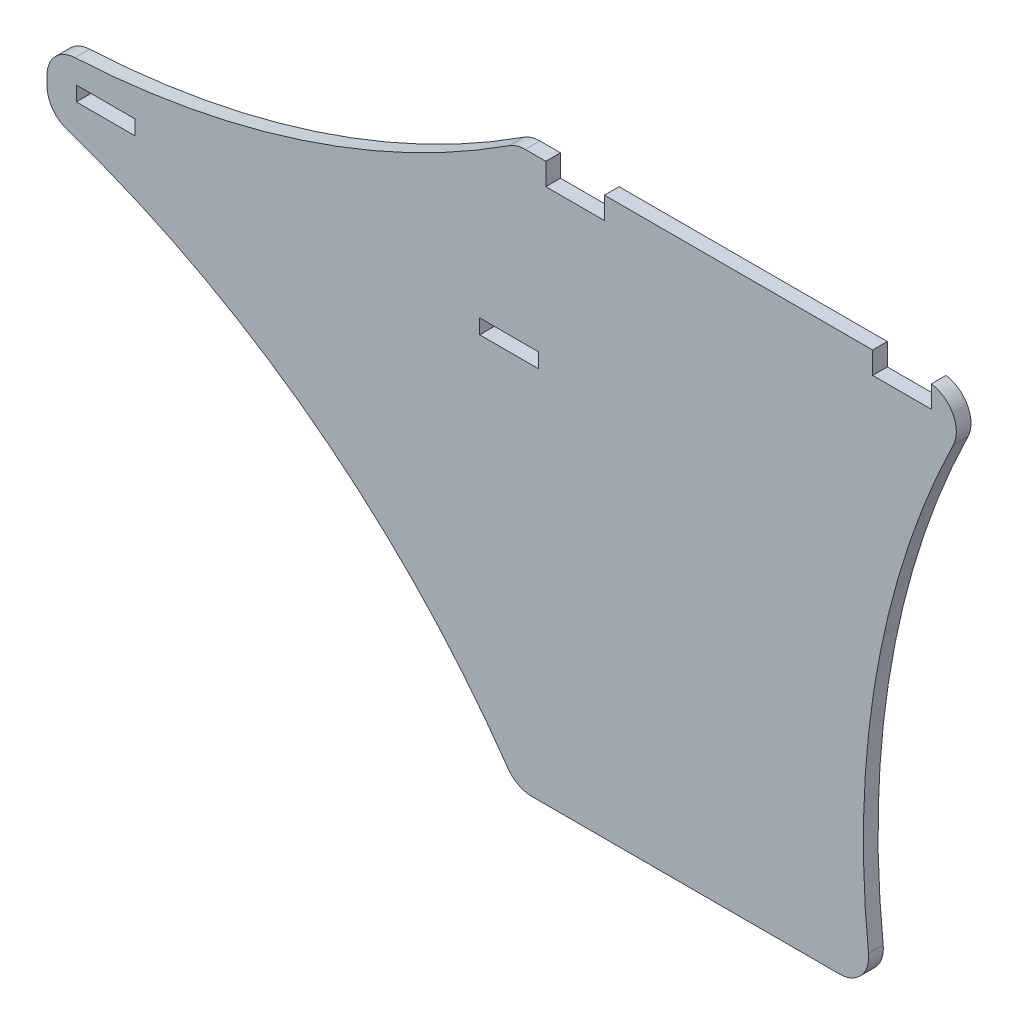
ISO-10303-21;
HEADER;
FILE_DESCRIPTION(('STEP AP214'),'2;1');
FILE_NAME('part.step','',(''),(''),'','','');
FILE_SCHEMA(('AUTOMOTIVE_DESIGN { 1 0 10303 214 1 1 1 1 }'));
ENDSEC;
DATA;
#1=APPLICATION_CONTEXT('core data for automotive mechanical design processes');
#2=APPLICATION_PROTOCOL_DEFINITION('international standard','automotive_design',2000,#1);
#3=PRODUCT_CONTEXT('',#1,'mechanical');
#4=PRODUCT('Part','Part','',(#3));
#5=PRODUCT_RELATED_PRODUCT_CATEGORY('part','',(#4));
#6=PRODUCT_DEFINITION_FORMATION('','',#4);
#7=PRODUCT_DEFINITION_CONTEXT('part definition',#1,'design');
#8=PRODUCT_DEFINITION('design','',#6,#7);
#9=PRODUCT_DEFINITION_SHAPE('','',#8);
#10=(LENGTH_UNIT() NAMED_UNIT(*) SI_UNIT(.MILLI.,.METRE.));
#11=(NAMED_UNIT(*) PLANE_ANGLE_UNIT() SI_UNIT($,.RADIAN.));
#12=(NAMED_UNIT(*) SI_UNIT($,.STERADIAN.) SOLID_ANGLE_UNIT());
#13=UNCERTAINTY_MEASURE_WITH_UNIT(LENGTH_MEASURE(1.E-05),#10,'distance_accuracy_value','');
#14=(GEOMETRIC_REPRESENTATION_CONTEXT(3) GLOBAL_UNCERTAINTY_ASSIGNED_CONTEXT((#13)) GLOBAL_UNIT_ASSIGNED_CONTEXT((#10,
#11,#12)) REPRESENTATION_CONTEXT('',''));
#15=CARTESIAN_POINT('',(0.,0.,0.));
#16=DIRECTION('',(0.,0.,1.));
#17=DIRECTION('',(1.,0.,0.));
#18=AXIS2_PLACEMENT_3D('',#15,#16,#17);
#19=CARTESIAN_POINT('',(-232.821173919376,-373.145632126541,6.35));
#20=DIRECTION('',(0.,0.,-1.));
#21=DIRECTION('',(-1.,0.,0.));
#22=AXIS2_PLACEMENT_3D('',#19,#20,#21);
#23=CYLINDRICAL_SURFACE('',#22,381.);
#24=CARTESIAN_POINT('',(-232.821173919376,-373.145632126541,0.));
#25=DIRECTION('',(0.,0.,-1.));
#26=DIRECTION('',(-1.,0.,0.));
#27=AXIS2_PLACEMENT_3D('',#24,#25,#26);
#28=CIRCLE('',#27,381.);
#29=CARTESIAN_POINT('',(-110.441812061915,-12.335028358635,0.));
#30=VERTEX_POINT('',#29);
#31=CARTESIAN_POINT('',(80.4677697258344,-156.325342970595,0.));
#32=VERTEX_POINT('',#31);
#33=EDGE_CURVE('E286',#30,#32,#28,.T.);
#34=ORIENTED_EDGE('',*,*,#33,.T.);
#35=DIRECTION('',(0.,0.,-1.));
#36=VECTOR('',#35,1.);
#37=CARTESIAN_POINT('',(80.4677697258345,-156.325342970595,6.35));
#38=LINE('',#37,#36);
#39=CARTESIAN_POINT('',(80.4677697258344,-156.325342970595,6.35));
#40=VERTEX_POINT('',#39);
#41=EDGE_CURVE('E391',#32,#40,#38,.F.);
#42=ORIENTED_EDGE('',*,*,#41,.T.);
#43=CARTESIAN_POINT('',(-232.821173919376,-373.145632126541,6.35));
#44=DIRECTION('',(0.,0.,-1.));
#45=DIRECTION('',(-1.,0.,0.));
#46=AXIS2_PLACEMENT_3D('',#43,#44,#45);
#47=CIRCLE('',#46,381.);
#48=CARTESIAN_POINT('',(-110.441812061915,-12.335028358635,6.35));
#49=VERTEX_POINT('',#48);
#50=EDGE_CURVE('E287',#49,#40,#47,.T.);
#51=ORIENTED_EDGE('',*,*,#50,.F.);
#52=DIRECTION('',(0.,0.,-1.));
#53=VECTOR('',#52,1.);
#54=CARTESIAN_POINT('',(-110.441812061915,-12.335028358635,6.35));
#55=LINE('',#54,#53);
#56=EDGE_CURVE('E388',#49,#30,#55,.T.);
#57=ORIENTED_EDGE('',*,*,#56,.T.);
#58=EDGE_LOOP('',(#34,#42,#51,#57));
#59=FACE_BOUND('',#58,.T.);
#60=ADVANCED_FACE('F33',(#59),#23,.F.);
#61=CARTESIAN_POINT('',(238.394583461122,-161.79799999873,6.35));
#62=DIRECTION('',(0.,1.,0.));
#63=DIRECTION('',(-1.,0.,0.));
#64=AXIS2_PLACEMENT_3D('',#61,#62,#63);
#65=PLANE('',#64);
#66=DIRECTION('',(1.,0.,0.));
#67=VECTOR('',#66,1.);
#68=CARTESIAN_POINT('',(238.394583461122,-161.79799999873,6.35));
#69=LINE('',#68,#67);
#70=CARTESIAN_POINT('',(90.9107345140081,-161.79799999873,6.35));
#71=VERTEX_POINT('',#70);
#72=CARTESIAN_POINT('',(223.975204109594,-161.79799999873,6.35));
#73=VERTEX_POINT('',#72);
#74=EDGE_CURVE('E290',#71,#73,#69,.T.);
#75=ORIENTED_EDGE('',*,*,#74,.F.);
#76=DIRECTION('',(0.,0.,-1.));
#77=VECTOR('',#76,1.);
#78=CARTESIAN_POINT('',(90.9107345140081,-161.79799999873,6.35));
#79=LINE('',#78,#77);
#80=CARTESIAN_POINT('',(90.9107345140081,-161.79799999873,0.));
#81=VERTEX_POINT('',#80);
#82=EDGE_CURVE('E373',#71,#81,#79,.T.);
#83=ORIENTED_EDGE('',*,*,#82,.T.);
#84=DIRECTION('',(1.,0.,0.));
#85=VECTOR('',#84,1.);
#86=CARTESIAN_POINT('',(238.394583461122,-161.79799999873,0.));
#87=LINE('',#86,#85);
#88=CARTESIAN_POINT('',(223.975204109594,-161.79799999873,0.));
#89=VERTEX_POINT('',#88);
#90=EDGE_CURVE('E321',#81,#89,#87,.T.);
#91=ORIENTED_EDGE('',*,*,#90,.T.);
#92=DIRECTION('',(0.,0.,-1.));
#93=VECTOR('',#92,1.);
#94=CARTESIAN_POINT('',(223.975204109594,-161.79799999873,6.35));
#95=LINE('',#94,#93);
#96=EDGE_CURVE('E371',#89,#73,#95,.F.);
#97=ORIENTED_EDGE('',*,*,#96,.T.);
#98=EDGE_LOOP('',(#75,#83,#91,#97));
#99=FACE_BOUND('',#98,.T.);
#100=ADVANCED_FACE('F438',(#99),#65,.F.);
#101=CARTESIAN_POINT('',(615.374263905706,-106.5954590074,6.35));
#102=DIRECTION('',(0.,0.,-1.));
#103=DIRECTION('',(-1.,0.,0.));
#104=AXIS2_PLACEMENT_3D('',#101,#102,#103);
#105=CYLINDRICAL_SURFACE('',#104,381.);
#106=CARTESIAN_POINT('',(615.374263905706,-106.5954590074,6.35));
#107=DIRECTION('',(0.,0.,-1.));
#108=DIRECTION('',(1.,0.,0.));
#109=AXIS2_PLACEMENT_3D('',#106,#107,#108);
#110=CIRCLE('',#109,381.);
#111=CARTESIAN_POINT('',(236.600980232049,-147.726950289332,6.35));
#112=VERTEX_POINT('',#111);
#113=CARTESIAN_POINT('',(273.323160749775,61.2200433450665,6.35));
#114=VERTEX_POINT('',#113);
#115=EDGE_CURVE('E294',#112,#114,#110,.T.);
#116=ORIENTED_EDGE('',*,*,#115,.F.);
#117=DIRECTION('',(0.,0.,-1.));
#118=VECTOR('',#117,1.);
#119=CARTESIAN_POINT('',(236.600980232049,-147.726950289332,6.35));
#120=LINE('',#119,#118);
#121=CARTESIAN_POINT('',(236.600980232049,-147.726950289332,0.));
#122=VERTEX_POINT('',#121);
#123=EDGE_CURVE('E406',#112,#122,#120,.T.);
#124=ORIENTED_EDGE('',*,*,#123,.T.);
#125=CARTESIAN_POINT('',(615.374263905706,-106.5954590074,0.));
#126=DIRECTION('',(0.,0.,-1.));
#127=DIRECTION('',(1.,0.,0.));
#128=AXIS2_PLACEMENT_3D('',#125,#126,#127);
#129=CIRCLE('',#128,381.);
#130=CARTESIAN_POINT('',(273.323160749775,61.2200433450666,0.));
#131=VERTEX_POINT('',#130);
#132=EDGE_CURVE('E324',#122,#131,#129,.T.);
#133=ORIENTED_EDGE('',*,*,#132,.T.);
#134=DIRECTION('',(0.,0.,-1.));
#135=VECTOR('',#134,1.);
#136=CARTESIAN_POINT('',(273.323160749775,61.2200433450666,6.35));
#137=LINE('',#136,#135);
#138=EDGE_CURVE('E404',#131,#114,#137,.F.);
#139=ORIENTED_EDGE('',*,*,#138,.T.);
#140=EDGE_LOOP('',(#116,#124,#133,#139));
#141=FACE_BOUND('',#140,.T.);
#142=ADVANCED_FACE('F447',(#141),#105,.F.);
#143=CARTESIAN_POINT('',(263.794583461122,69.85,6.35));
#144=DIRECTION('',(1.,0.,0.));
#145=DIRECTION('',(0.,0.,-1.));
#146=AXIS2_PLACEMENT_3D('',#143,#144,#145);
#147=PLANE('',#146);
#148=DIRECTION('',(0.,-1.,0.));
#149=VECTOR('',#148,1.);
#150=CARTESIAN_POINT('',(263.794583461122,69.85,0.));
#151=LINE('',#150,#149);
#152=CARTESIAN_POINT('',(263.794583461122,79.375,0.));
#153=VERTEX_POINT('',#152);
#154=CARTESIAN_POINT('',(263.794583461122,69.85,0.));
#155=VERTEX_POINT('',#154);
#156=EDGE_CURVE('E327',#153,#155,#151,.T.);
#157=ORIENTED_EDGE('',*,*,#156,.T.);
#158=DIRECTION('',(0.,0.,-1.));
#159=VECTOR('',#158,1.);
#160=CARTESIAN_POINT('',(263.794583461122,69.85,6.35));
#161=LINE('',#160,#159);
#162=CARTESIAN_POINT('',(263.794583461122,69.85,6.35));
#163=VERTEX_POINT('',#162);
#164=EDGE_CURVE('E365',#163,#155,#161,.T.);
#165=ORIENTED_EDGE('',*,*,#164,.F.);
#166=DIRECTION('',(0.,-1.,0.));
#167=VECTOR('',#166,1.);
#168=CARTESIAN_POINT('',(263.794583461122,69.85,6.35));
#169=LINE('',#168,#167);
#170=CARTESIAN_POINT('',(263.794583461122,79.375,6.35));
#171=VERTEX_POINT('',#170);
#172=EDGE_CURVE('E297',#171,#163,#169,.T.);
#173=ORIENTED_EDGE('',*,*,#172,.F.);
#174=DIRECTION('',(0.,0.,-1.));
#175=VECTOR('',#174,1.);
#176=CARTESIAN_POINT('',(263.794583461122,79.375,6.35));
#177=LINE('',#176,#175);
#178=EDGE_CURVE('E368',#171,#153,#177,.T.);
#179=ORIENTED_EDGE('',*,*,#178,.T.);
#180=EDGE_LOOP('',(#157,#165,#173,#179));
#181=FACE_BOUND('',#180,.T.);
#182=ADVANCED_FACE('F456',(#181),#147,.F.);
#183=CARTESIAN_POINT('',(238.394583461122,69.85,6.35));
#184=DIRECTION('',(0.,-1.,0.));
#185=DIRECTION('',(0.,0.,-1.));
#186=AXIS2_PLACEMENT_3D('',#183,#184,#185);
#187=PLANE('',#186);
#188=DIRECTION('',(-1.,0.,0.));
#189=VECTOR('',#188,1.);
#190=CARTESIAN_POINT('',(238.394583461122,69.85,0.));
#191=LINE('',#190,#189);
#192=CARTESIAN_POINT('',(238.394583461122,69.85,0.));
#193=VERTEX_POINT('',#192);
#194=EDGE_CURVE('E329',#155,#193,#191,.T.);
#195=ORIENTED_EDGE('',*,*,#194,.T.);
#196=DIRECTION('',(0.,0.,-1.));
#197=VECTOR('',#196,1.);
#198=CARTESIAN_POINT('',(238.394583461122,69.85,6.35));
#199=LINE('',#198,#197);
#200=CARTESIAN_POINT('',(238.394583461122,69.85,6.35));
#201=VERTEX_POINT('',#200);
#202=EDGE_CURVE('E362',#201,#193,#199,.T.);
#203=ORIENTED_EDGE('',*,*,#202,.F.);
#204=DIRECTION('',(-1.,0.,0.));
#205=VECTOR('',#204,1.);
#206=CARTESIAN_POINT('',(238.394583461122,69.85,6.35));
#207=LINE('',#206,#205);
#208=EDGE_CURVE('E299',#163,#201,#207,.T.);
#209=ORIENTED_EDGE('',*,*,#208,.F.);
#210=ORIENTED_EDGE('',*,*,#164,.T.);
#211=EDGE_LOOP('',(#195,#203,#209,#210));
#212=FACE_BOUND('',#211,.T.);
#213=ADVANCED_FACE('F463',(#212),#187,.F.);
#214=CARTESIAN_POINT('',(238.394583461122,79.375,6.35));
#215=DIRECTION('',(-1.,0.,0.));
#216=DIRECTION('',(0.,0.,1.));
#217=AXIS2_PLACEMENT_3D('',#214,#215,#216);
#218=PLANE('',#217);
#219=DIRECTION('',(0.,1.,0.));
#220=VECTOR('',#219,1.);
#221=CARTESIAN_POINT('',(238.394583461122,79.375,0.));
#222=LINE('',#221,#220);
#223=CARTESIAN_POINT('',(238.394583461122,79.375,0.));
#224=VERTEX_POINT('',#223);
#225=EDGE_CURVE('E331',#193,#224,#222,.T.);
#226=ORIENTED_EDGE('',*,*,#225,.T.);
#227=DIRECTION('',(0.,0.,-1.));
#228=VECTOR('',#227,1.);
#229=CARTESIAN_POINT('',(238.394583461122,79.375,6.35));
#230=LINE('',#229,#228);
#231=CARTESIAN_POINT('',(238.394583461122,79.375,6.35));
#232=VERTEX_POINT('',#231);
#233=EDGE_CURVE('E359',#232,#224,#230,.T.);
#234=ORIENTED_EDGE('',*,*,#233,.F.);
#235=DIRECTION('',(0.,1.,0.));
#236=VECTOR('',#235,1.);
#237=CARTESIAN_POINT('',(238.394583461122,79.375,6.35));
#238=LINE('',#237,#236);
#239=EDGE_CURVE('E301',#201,#232,#238,.T.);
#240=ORIENTED_EDGE('',*,*,#239,.F.);
#241=ORIENTED_EDGE('',*,*,#202,.T.);
#242=EDGE_LOOP('',(#226,#234,#240,#241));
#243=FACE_BOUND('',#242,.T.);
#244=ADVANCED_FACE('F467',(#243),#218,.F.);
#245=CARTESIAN_POINT('',(122.285416538878,79.375,6.35));
#246=DIRECTION('',(0.,-1.,0.));
#247=DIRECTION('',(1.,0.,0.));
#248=AXIS2_PLACEMENT_3D('',#245,#246,#247);
#249=PLANE('',#248);
#250=DIRECTION('',(-1.,0.,0.));
#251=VECTOR('',#250,1.);
#252=CARTESIAN_POINT('',(122.285416538878,79.375,0.));
#253=LINE('',#252,#251);
#254=CARTESIAN_POINT('',(122.285416538878,79.375,0.));
#255=VERTEX_POINT('',#254);
#256=EDGE_CURVE('E333',#224,#255,#253,.T.);
#257=ORIENTED_EDGE('',*,*,#256,.T.);
#258=DIRECTION('',(0.,0.,-1.));
#259=VECTOR('',#258,1.);
#260=CARTESIAN_POINT('',(122.285416538878,79.375,6.35));
#261=LINE('',#260,#259);
#262=CARTESIAN_POINT('',(122.285416538878,79.375,6.35));
#263=VERTEX_POINT('',#262);
#264=EDGE_CURVE('E356',#263,#255,#261,.T.);
#265=ORIENTED_EDGE('',*,*,#264,.F.);
#266=DIRECTION('',(-1.,0.,0.));
#267=VECTOR('',#266,1.);
#268=CARTESIAN_POINT('',(122.285416538878,79.375,6.35));
#269=LINE('',#268,#267);
#270=EDGE_CURVE('E303',#232,#263,#269,.T.);
#271=ORIENTED_EDGE('',*,*,#270,.F.);
#272=ORIENTED_EDGE('',*,*,#233,.T.);
#273=EDGE_LOOP('',(#257,#265,#271,#272));
#274=FACE_BOUND('',#273,.T.);
#275=ADVANCED_FACE('F474',(#274),#249,.F.);
#276=CARTESIAN_POINT('',(122.285416538878,69.85,6.35));
#277=DIRECTION('',(1.,0.,0.));
#278=DIRECTION('',(0.,0.,-1.));
#279=AXIS2_PLACEMENT_3D('',#276,#277,#278);
#280=PLANE('',#279);
#281=DIRECTION('',(0.,-1.,0.));
#282=VECTOR('',#281,1.);
#283=CARTESIAN_POINT('',(122.285416538878,69.85,0.));
#284=LINE('',#283,#282);
#285=CARTESIAN_POINT('',(122.285416538878,69.85,0.));
#286=VERTEX_POINT('',#285);
#287=EDGE_CURVE('E335',#255,#286,#284,.T.);
#288=ORIENTED_EDGE('',*,*,#287,.T.);
#289=DIRECTION('',(0.,0.,-1.));
#290=VECTOR('',#289,1.);
#291=CARTESIAN_POINT('',(122.285416538878,69.85,6.35));
#292=LINE('',#291,#290);
#293=CARTESIAN_POINT('',(122.285416538878,69.85,6.35));
#294=VERTEX_POINT('',#293);
#295=EDGE_CURVE('E353',#294,#286,#292,.T.);
#296=ORIENTED_EDGE('',*,*,#295,.F.);
#297=DIRECTION('',(0.,-1.,0.));
#298=VECTOR('',#297,1.);
#299=CARTESIAN_POINT('',(122.285416538878,69.85,6.35));
#300=LINE('',#299,#298);
#301=EDGE_CURVE('E305',#263,#294,#300,.T.);
#302=ORIENTED_EDGE('',*,*,#301,.F.);
#303=ORIENTED_EDGE('',*,*,#264,.T.);
#304=EDGE_LOOP('',(#288,#296,#302,#303));
#305=FACE_BOUND('',#304,.T.);
#306=ADVANCED_FACE('F477',(#305),#280,.F.);
#307=CARTESIAN_POINT('',(96.8854165388784,69.85,6.35));
#308=DIRECTION('',(0.,-1.,0.));
#309=DIRECTION('',(0.,0.,-1.));
#310=AXIS2_PLACEMENT_3D('',#307,#308,#309);
#311=PLANE('',#310);
#312=DIRECTION('',(-1.,0.,0.));
#313=VECTOR('',#312,1.);
#314=CARTESIAN_POINT('',(96.8854165388784,69.85,0.));
#315=LINE('',#314,#313);
#316=CARTESIAN_POINT('',(96.8854165388784,69.85,0.));
#317=VERTEX_POINT('',#316);
#318=EDGE_CURVE('E337',#286,#317,#315,.T.);
#319=ORIENTED_EDGE('',*,*,#318,.T.);
#320=DIRECTION('',(0.,0.,-1.));
#321=VECTOR('',#320,1.);
#322=CARTESIAN_POINT('',(96.8854165388784,69.85,6.35));
#323=LINE('',#322,#321);
#324=CARTESIAN_POINT('',(96.8854165388784,69.85,6.35));
#325=VERTEX_POINT('',#324);
#326=EDGE_CURVE('E350',#325,#317,#323,.T.);
#327=ORIENTED_EDGE('',*,*,#326,.F.);
#328=DIRECTION('',(-1.,0.,0.));
#329=VECTOR('',#328,1.);
#330=CARTESIAN_POINT('',(96.8854165388784,69.85,6.35));
#331=LINE('',#330,#329);
#332=EDGE_CURVE('E307',#294,#325,#331,.T.);
#333=ORIENTED_EDGE('',*,*,#332,.F.);
#334=ORIENTED_EDGE('',*,*,#295,.T.);
#335=EDGE_LOOP('',(#319,#327,#333,#334));
#336=FACE_BOUND('',#335,.T.);
#337=ADVANCED_FACE('F482',(#336),#311,.F.);
#338=CARTESIAN_POINT('',(96.8854165388784,79.375,6.35));
#339=DIRECTION('',(-1.,0.,0.));
#340=DIRECTION('',(0.,0.,1.));
#341=AXIS2_PLACEMENT_3D('',#338,#339,#340);
#342=PLANE('',#341);
#343=DIRECTION('',(0.,1.,0.));
#344=VECTOR('',#343,1.);
#345=CARTESIAN_POINT('',(96.8854165388784,79.375,0.));
#346=LINE('',#345,#344);
#347=CARTESIAN_POINT('',(96.8854165388784,79.375,0.));
#348=VERTEX_POINT('',#347);
#349=EDGE_CURVE('E339',#317,#348,#346,.T.);
#350=ORIENTED_EDGE('',*,*,#349,.T.);
#351=DIRECTION('',(0.,0.,-1.));
#352=VECTOR('',#351,1.);
#353=CARTESIAN_POINT('',(96.8854165388784,79.375,6.35));
#354=LINE('',#353,#352);
#355=CARTESIAN_POINT('',(96.8854165388784,79.375,6.35));
#356=VERTEX_POINT('',#355);
#357=EDGE_CURVE('E318',#356,#348,#354,.T.);
#358=ORIENTED_EDGE('',*,*,#357,.F.);
#359=DIRECTION('',(0.,1.,0.));
#360=VECTOR('',#359,1.);
#361=CARTESIAN_POINT('',(96.8854165388784,79.375,6.35));
#362=LINE('',#361,#360);
#363=EDGE_CURVE('E309',#325,#356,#362,.T.);
#364=ORIENTED_EDGE('',*,*,#363,.F.);
#365=ORIENTED_EDGE('',*,*,#326,.T.);
#366=EDGE_LOOP('',(#350,#358,#364,#365));
#367=FACE_BOUND('',#366,.T.);
#368=ADVANCED_FACE('F488',(#367),#342,.F.);
#369=CARTESIAN_POINT('',(96.8854165388784,79.375,6.35));
#370=DIRECTION('',(0.,-1.,0.));
#371=DIRECTION('',(1.,0.,0.));
#372=AXIS2_PLACEMENT_3D('',#369,#370,#371);
#373=PLANE('',#372);
#374=DIRECTION('',(-1.,0.,0.));
#375=VECTOR('',#374,1.);
#376=CARTESIAN_POINT('',(96.8854165388784,79.375,0.));
#377=LINE('',#376,#375);
#378=CARTESIAN_POINT('',(87.9828007968317,79.375,0.));
#379=VERTEX_POINT('',#378);
#380=EDGE_CURVE('E341',#348,#379,#377,.T.);
#381=ORIENTED_EDGE('',*,*,#380,.T.);
#382=DIRECTION('',(0.,0.,-1.));
#383=VECTOR('',#382,1.);
#384=CARTESIAN_POINT('',(87.9828007968317,79.375,6.35));
#385=LINE('',#384,#383);
#386=CARTESIAN_POINT('',(87.9828007968317,79.375,6.35));
#387=VERTEX_POINT('',#386);
#388=EDGE_CURVE('E414',#379,#387,#385,.F.);
#389=ORIENTED_EDGE('',*,*,#388,.T.);
#390=DIRECTION('',(-1.,0.,0.));
#391=VECTOR('',#390,1.);
#392=CARTESIAN_POINT('',(96.8854165388784,79.375,6.35));
#393=LINE('',#392,#391);
#394=EDGE_CURVE('E311',#356,#387,#393,.T.);
#395=ORIENTED_EDGE('',*,*,#394,.F.);
#396=ORIENTED_EDGE('',*,*,#357,.T.);
#397=EDGE_LOOP('',(#381,#389,#395,#396));
#398=FACE_BOUND('',#397,.T.);
#399=ADVANCED_FACE('F492',(#398),#373,.F.);
#400=CARTESIAN_POINT('',(-126.530567184602,396.80180133134,6.35));
#401=DIRECTION('',(0.,0.,-1.));
#402=DIRECTION('',(-1.,0.,0.));
#403=AXIS2_PLACEMENT_3D('',#400,#401,#402);
#404=CYLINDRICAL_SURFACE('',#403,381.);
#405=CARTESIAN_POINT('',(-126.530567184602,396.80180133134,6.35));
#406=DIRECTION('',(0.,0.,-1.));
#407=DIRECTION('',(1.,0.,0.));
#408=AXIS2_PLACEMENT_3D('',#405,#406,#407);
#409=CIRCLE('',#408,381.);
#410=CARTESIAN_POINT('',(81.0630147329146,77.3242516558497,6.35));
#411=VERTEX_POINT('',#410);
#412=CARTESIAN_POINT('',(-107.013082812406,16.3020407482603,6.35));
#413=VERTEX_POINT('',#412);
#414=EDGE_CURVE('E314',#411,#413,#409,.T.);
#415=ORIENTED_EDGE('',*,*,#414,.F.);
#416=DIRECTION('',(0.,0.,-1.));
#417=VECTOR('',#416,1.);
#418=CARTESIAN_POINT('',(81.0630147329146,77.3242516558496,6.35));
#419=LINE('',#418,#417);
#420=CARTESIAN_POINT('',(81.0630147329146,77.3242516558497,0.));
#421=VERTEX_POINT('',#420);
#422=EDGE_CURVE('E411',#411,#421,#419,.T.);
#423=ORIENTED_EDGE('',*,*,#422,.T.);
#424=CARTESIAN_POINT('',(-126.530567184602,396.80180133134,0.));
#425=DIRECTION('',(0.,0.,-1.));
#426=DIRECTION('',(1.,0.,0.));
#427=AXIS2_PLACEMENT_3D('',#424,#425,#426);
#428=CIRCLE('',#427,381.);
#429=CARTESIAN_POINT('',(-107.013082812406,16.3020407482603,0.));
#430=VERTEX_POINT('',#429);
#431=EDGE_CURVE('E344',#421,#430,#428,.T.);
#432=ORIENTED_EDGE('',*,*,#431,.T.);
#433=DIRECTION('',(0.,0.,-1.));
#434=VECTOR('',#433,1.);
#435=CARTESIAN_POINT('',(-107.013082812406,16.3020407482602,6.35));
#436=LINE('',#435,#434);
#437=EDGE_CURVE('E409',#430,#413,#436,.F.);
#438=ORIENTED_EDGE('',*,*,#437,.T.);
#439=EDGE_LOOP('',(#415,#423,#432,#438));
#440=FACE_BOUND('',#439,.T.);
#441=ADVANCED_FACE('F499',(#440),#404,.F.);
#442=CARTESIAN_POINT('',(-119.0625,-9.525,6.35));
#443=DIRECTION('',(1.,0.,0.));
#444=DIRECTION('',(0.,0.,-1.));
#445=AXIS2_PLACEMENT_3D('',#442,#443,#444);
#446=PLANE('',#445);
#447=DIRECTION('',(0.,-1.,0.));
#448=VECTOR('',#447,1.);
#449=CARTESIAN_POINT('',(-119.0625,-9.525,0.));
#450=LINE('',#449,#448);
#451=CARTESIAN_POINT('',(-119.0625,3.61871539549091,0.));
#452=VERTEX_POINT('',#451);
#453=CARTESIAN_POINT('',(-119.0625,-0.308008233038171,0.));
#454=VERTEX_POINT('',#453);
#455=EDGE_CURVE('E291',#452,#454,#450,.T.);
#456=ORIENTED_EDGE('',*,*,#455,.T.);
#457=DIRECTION('',(0.,0.,-1.));
#458=VECTOR('',#457,1.);
#459=CARTESIAN_POINT('',(-119.0625,-0.308008233038171,6.35));
#460=LINE('',#459,#458);
#461=CARTESIAN_POINT('',(-119.0625,-0.308008233038171,6.35));
#462=VERTEX_POINT('',#461);
#463=EDGE_CURVE('E11',#454,#462,#460,.F.);
#464=ORIENTED_EDGE('',*,*,#463,.T.);
#465=DIRECTION('',(0.,-1.,0.));
#466=VECTOR('',#465,1.);
#467=CARTESIAN_POINT('',(-119.0625,-9.525,6.35));
#468=LINE('',#467,#466);
#469=CARTESIAN_POINT('',(-119.0625,3.61871539549091,6.35));
#470=VERTEX_POINT('',#469);
#471=EDGE_CURVE('E316',#470,#462,#468,.T.);
#472=ORIENTED_EDGE('',*,*,#471,.F.);
#473=DIRECTION('',(0.,0.,-1.));
#474=VECTOR('',#473,1.);
#475=CARTESIAN_POINT('',(-119.0625,3.61871539549091,6.35));
#476=LINE('',#475,#474);
#477=EDGE_CURVE('E41',#470,#452,#476,.T.);
#478=ORIENTED_EDGE('',*,*,#477,.T.);
#479=EDGE_LOOP('',(#456,#464,#472,#478));
#480=FACE_BOUND('',#479,.T.);
#481=ADVANCED_FACE('F418',(#480),#446,.F.);
#482=CARTESIAN_POINT('',(-232.821173919376,-373.145632126541,6.35));
#483=DIRECTION('',(0.,0.,-1.));
#484=DIRECTION('',(-1.,0.,0.));
#485=AXIS2_PLACEMENT_3D('',#482,#483,#484);
#486=PLANE('',#485);
#487=DIRECTION('',(1.,0.,0.));
#488=VECTOR('',#487,1.);
#489=CARTESIAN_POINT('',(-106.3625,0.,6.35));
#490=LINE('',#489,#488);
#491=CARTESIAN_POINT('',(-106.3625,0.,6.35));
#492=VERTEX_POINT('',#491);
#493=CARTESIAN_POINT('',(-80.9625,0.,6.35));
#494=VERTEX_POINT('',#493);
#495=EDGE_CURVE('E239',#492,#494,#490,.T.);
#496=ORIENTED_EDGE('',*,*,#495,.F.);
#497=DIRECTION('',(0.,-1.,0.));
#498=VECTOR('',#497,1.);
#499=CARTESIAN_POINT('',(-106.3625,6.35,6.35));
#500=LINE('',#499,#498);
#501=CARTESIAN_POINT('',(-106.3625,6.35,6.35));
#502=VERTEX_POINT('',#501);
#503=EDGE_CURVE('E231',#502,#492,#500,.T.);
#504=ORIENTED_EDGE('',*,*,#503,.F.);
#505=DIRECTION('',(-1.,0.,0.));
#506=VECTOR('',#505,1.);
#507=CARTESIAN_POINT('',(-106.3625,6.35,6.35));
#508=LINE('',#507,#506);
#509=CARTESIAN_POINT('',(-80.9625,6.35,6.35));
#510=VERTEX_POINT('',#509);
#511=EDGE_CURVE('E232',#510,#502,#508,.T.);
#512=ORIENTED_EDGE('',*,*,#511,.F.);
#513=DIRECTION('',(0.,1.,0.));
#514=VECTOR('',#513,1.);
#515=CARTESIAN_POINT('',(-80.9625,6.35,6.35));
#516=LINE('',#515,#514);
#517=EDGE_CURVE('E246',#494,#510,#516,.T.);
#518=ORIENTED_EDGE('',*,*,#517,.F.);
#519=EDGE_LOOP('',(#496,#504,#512,#518));
#520=FACE_BOUND('',#519,.T.);
#521=DIRECTION('',(1.,0.,0.));
#522=VECTOR('',#521,1.);
#523=CARTESIAN_POINT('',(68.2625,0.,6.35));
#524=LINE('',#523,#522);
#525=CARTESIAN_POINT('',(68.2624999999999,0.,6.35));
#526=VERTEX_POINT('',#525);
#527=CARTESIAN_POINT('',(93.6625,0.,6.35));
#528=VERTEX_POINT('',#527);
#529=EDGE_CURVE('E265',#526,#528,#524,.T.);
#530=ORIENTED_EDGE('',*,*,#529,.F.);
#531=DIRECTION('',(0.,-1.,0.));
#532=VECTOR('',#531,1.);
#533=CARTESIAN_POINT('',(68.2625,6.35,6.35));
#534=LINE('',#533,#532);
#535=CARTESIAN_POINT('',(68.2625,6.35,6.35));
#536=VERTEX_POINT('',#535);
#537=EDGE_CURVE('E263',#536,#526,#534,.T.);
#538=ORIENTED_EDGE('',*,*,#537,.F.);
#539=DIRECTION('',(-1.,0.,0.));
#540=VECTOR('',#539,1.);
#541=CARTESIAN_POINT('',(68.2625,6.35,6.35));
#542=LINE('',#541,#540);
#543=CARTESIAN_POINT('',(93.6625,6.35,6.35));
#544=VERTEX_POINT('',#543);
#545=EDGE_CURVE('E271',#544,#536,#542,.T.);
#546=ORIENTED_EDGE('',*,*,#545,.F.);
#547=DIRECTION('',(0.,1.,0.));
#548=VECTOR('',#547,1.);
#549=CARTESIAN_POINT('',(93.6625,6.35,6.35));
#550=LINE('',#549,#548);
#551=EDGE_CURVE('E268',#528,#544,#550,.T.);
#552=ORIENTED_EDGE('',*,*,#551,.F.);
#553=EDGE_LOOP('',(#530,#538,#546,#552));
#554=FACE_BOUND('',#553,.T.);
#555=ORIENTED_EDGE('',*,*,#50,.T.);
#556=CARTESIAN_POINT('',(90.9107345140081,-149.09799999873,6.35));
#557=DIRECTION('',(0.,0.,-1.));
#558=DIRECTION('',(-1.,0.,0.));
#559=AXIS2_PLACEMENT_3D('',#556,#557,#558);
#560=CIRCLE('',#559,12.7);
#561=EDGE_CURVE('E402',#40,#71,#560,.F.);
#562=ORIENTED_EDGE('',*,*,#561,.T.);
#563=ORIENTED_EDGE('',*,*,#74,.T.);
#564=CARTESIAN_POINT('',(223.975204109594,-149.09799999873,6.35));
#565=DIRECTION('',(0.,0.,-1.));
#566=DIRECTION('',(-1.,0.,0.));
#567=AXIS2_PLACEMENT_3D('',#564,#565,#566);
#568=CIRCLE('',#567,12.7);
#569=EDGE_CURVE('E400',#73,#112,#568,.F.);
#570=ORIENTED_EDGE('',*,*,#569,.T.);
#571=ORIENTED_EDGE('',*,*,#115,.T.);
#572=CARTESIAN_POINT('',(261.921457311244,66.8138934234821,6.35));
#573=DIRECTION('',(0.,0.,-1.));
#574=DIRECTION('',(-1.,0.,0.));
#575=AXIS2_PLACEMENT_3D('',#572,#573,#574);
#576=CIRCLE('',#575,12.7);
#577=EDGE_CURVE('E398',#114,#171,#576,.F.);
#578=ORIENTED_EDGE('',*,*,#577,.T.);
#579=ORIENTED_EDGE('',*,*,#172,.T.);
#580=ORIENTED_EDGE('',*,*,#208,.T.);
#581=ORIENTED_EDGE('',*,*,#239,.T.);
#582=ORIENTED_EDGE('',*,*,#270,.T.);
#583=ORIENTED_EDGE('',*,*,#301,.T.);
#584=ORIENTED_EDGE('',*,*,#332,.T.);
#585=ORIENTED_EDGE('',*,*,#363,.T.);
#586=ORIENTED_EDGE('',*,*,#394,.T.);
#587=CARTESIAN_POINT('',(87.9828007968318,66.675,6.35));
#588=DIRECTION('',(0.,0.,-1.));
#589=DIRECTION('',(-1.,0.,0.));
#590=AXIS2_PLACEMENT_3D('',#587,#588,#589);
#591=CIRCLE('',#590,12.7);
#592=EDGE_CURVE('E396',#387,#411,#591,.F.);
#593=ORIENTED_EDGE('',*,*,#592,.T.);
#594=ORIENTED_EDGE('',*,*,#414,.T.);
#595=CARTESIAN_POINT('',(-106.3625,3.61871539549091,6.35));
#596=DIRECTION('',(0.,0.,-1.));
#597=DIRECTION('',(-1.,0.,0.));
#598=AXIS2_PLACEMENT_3D('',#595,#596,#597);
#599=CIRCLE('',#598,12.7);
#600=EDGE_CURVE('E53',#413,#470,#599,.F.);
#601=ORIENTED_EDGE('',*,*,#600,.T.);
#602=ORIENTED_EDGE('',*,*,#471,.T.);
#603=CARTESIAN_POINT('',(-106.3625,-0.308008233038171,6.35));
#604=DIRECTION('',(0.,0.,-1.));
#605=DIRECTION('',(-1.,0.,0.));
#606=AXIS2_PLACEMENT_3D('',#603,#604,#605);
#607=CIRCLE('',#606,12.7);
#608=EDGE_CURVE('E394',#462,#49,#607,.F.);
#609=ORIENTED_EDGE('',*,*,#608,.T.);
#610=EDGE_LOOP('',(#555,#562,#563,#570,#571,#578,#579,#580,#581,#582,#583,#584,#585,#586,#593,
#594,#601,#602,#609));
#611=FACE_BOUND('',#610,.T.);
#612=ADVANCED_FACE('F432',(#520,#554,#611),#486,.F.);
#613=CARTESIAN_POINT('',(-232.821173919376,-373.145632126541,0.));
#614=DIRECTION('',(0.,0.,-1.));
#615=DIRECTION('',(-1.,0.,0.));
#616=AXIS2_PLACEMENT_3D('',#613,#614,#615);
#617=PLANE('',#616);
#618=DIRECTION('',(0.,-1.,0.));
#619=VECTOR('',#618,1.);
#620=CARTESIAN_POINT('',(-106.3625,6.35,0.));
#621=LINE('',#620,#619);
#622=CARTESIAN_POINT('',(-106.3625,6.35,0.));
#623=VERTEX_POINT('',#622);
#624=CARTESIAN_POINT('',(-106.3625,0.,0.));
#625=VERTEX_POINT('',#624);
#626=EDGE_CURVE('E228',#623,#625,#621,.T.);
#627=ORIENTED_EDGE('',*,*,#626,.T.);
#628=DIRECTION('',(1.,0.,0.));
#629=VECTOR('',#628,1.);
#630=CARTESIAN_POINT('',(-106.3625,0.,0.));
#631=LINE('',#630,#629);
#632=CARTESIAN_POINT('',(-80.9625,0.,0.));
#633=VERTEX_POINT('',#632);
#634=EDGE_CURVE('E212',#625,#633,#631,.T.);
#635=ORIENTED_EDGE('',*,*,#634,.T.);
#636=DIRECTION('',(0.,1.,0.));
#637=VECTOR('',#636,1.);
#638=CARTESIAN_POINT('',(-80.9625,6.35,0.));
#639=LINE('',#638,#637);
#640=CARTESIAN_POINT('',(-80.9625,6.35,0.));
#641=VERTEX_POINT('',#640);
#642=EDGE_CURVE('E241',#633,#641,#639,.T.);
#643=ORIENTED_EDGE('',*,*,#642,.T.);
#644=DIRECTION('',(-1.,0.,0.));
#645=VECTOR('',#644,1.);
#646=CARTESIAN_POINT('',(-106.3625,6.35,0.));
#647=LINE('',#646,#645);
#648=EDGE_CURVE('E237',#641,#623,#647,.T.);
#649=ORIENTED_EDGE('',*,*,#648,.T.);
#650=EDGE_LOOP('',(#627,#635,#643,#649));
#651=FACE_BOUND('',#650,.T.);
#652=DIRECTION('',(0.,-1.,0.));
#653=VECTOR('',#652,1.);
#654=CARTESIAN_POINT('',(68.2625,6.35,0.));
#655=LINE('',#654,#653);
#656=CARTESIAN_POINT('',(68.2625,6.35,0.));
#657=VERTEX_POINT('',#656);
#658=CARTESIAN_POINT('',(68.2625,0.,0.));
#659=VERTEX_POINT('',#658);
#660=EDGE_CURVE('E260',#657,#659,#655,.T.);
#661=ORIENTED_EDGE('',*,*,#660,.T.);
#662=DIRECTION('',(1.,0.,0.));
#663=VECTOR('',#662,1.);
#664=CARTESIAN_POINT('',(68.2625,0.,0.));
#665=LINE('',#664,#663);
#666=CARTESIAN_POINT('',(93.6625,0.,0.));
#667=VERTEX_POINT('',#666);
#668=EDGE_CURVE('E277',#659,#667,#665,.T.);
#669=ORIENTED_EDGE('',*,*,#668,.T.);
#670=DIRECTION('',(0.,1.,0.));
#671=VECTOR('',#670,1.);
#672=CARTESIAN_POINT('',(93.6625,6.35,0.));
#673=LINE('',#672,#671);
#674=CARTESIAN_POINT('',(93.6625,6.35,0.));
#675=VERTEX_POINT('',#674);
#676=EDGE_CURVE('E223',#667,#675,#673,.T.);
#677=ORIENTED_EDGE('',*,*,#676,.T.);
#678=DIRECTION('',(-1.,0.,0.));
#679=VECTOR('',#678,1.);
#680=CARTESIAN_POINT('',(68.2625,6.35,0.));
#681=LINE('',#680,#679);
#682=EDGE_CURVE('E257',#675,#657,#681,.T.);
#683=ORIENTED_EDGE('',*,*,#682,.T.);
#684=EDGE_LOOP('',(#661,#669,#677,#683));
#685=FACE_BOUND('',#684,.T.);
#686=ORIENTED_EDGE('',*,*,#90,.F.);
#687=CARTESIAN_POINT('',(90.9107345140081,-149.09799999873,0.));
#688=DIRECTION('',(0.,0.,-1.));
#689=DIRECTION('',(-1.,0.,0.));
#690=AXIS2_PLACEMENT_3D('',#687,#688,#689);
#691=CIRCLE('',#690,12.7);
#692=EDGE_CURVE('E386',#81,#32,#691,.T.);
#693=ORIENTED_EDGE('',*,*,#692,.T.);
#694=ORIENTED_EDGE('',*,*,#33,.F.);
#695=CARTESIAN_POINT('',(-106.3625,-0.308008233038171,0.));
#696=DIRECTION('',(0.,0.,-1.));
#697=DIRECTION('',(-1.,0.,0.));
#698=AXIS2_PLACEMENT_3D('',#695,#696,#697);
#699=CIRCLE('',#698,12.7);
#700=EDGE_CURVE('E378',#30,#454,#699,.T.);
#701=ORIENTED_EDGE('',*,*,#700,.T.);
#702=ORIENTED_EDGE('',*,*,#455,.F.);
#703=CARTESIAN_POINT('',(-106.3625,3.61871539549091,0.));
#704=DIRECTION('',(0.,0.,-1.));
#705=DIRECTION('',(-1.,0.,0.));
#706=AXIS2_PLACEMENT_3D('',#703,#704,#705);
#707=CIRCLE('',#706,12.7);
#708=EDGE_CURVE('E376',#452,#430,#707,.T.);
#709=ORIENTED_EDGE('',*,*,#708,.T.);
#710=ORIENTED_EDGE('',*,*,#431,.F.);
#711=CARTESIAN_POINT('',(87.9828007968318,66.675,0.));
#712=DIRECTION('',(0.,0.,-1.));
#713=DIRECTION('',(-1.,0.,0.));
#714=AXIS2_PLACEMENT_3D('',#711,#712,#713);
#715=CIRCLE('',#714,12.7);
#716=EDGE_CURVE('E380',#421,#379,#715,.T.);
#717=ORIENTED_EDGE('',*,*,#716,.T.);
#718=ORIENTED_EDGE('',*,*,#380,.F.);
#719=ORIENTED_EDGE('',*,*,#349,.F.);
#720=ORIENTED_EDGE('',*,*,#318,.F.);
#721=ORIENTED_EDGE('',*,*,#287,.F.);
#722=ORIENTED_EDGE('',*,*,#256,.F.);
#723=ORIENTED_EDGE('',*,*,#225,.F.);
#724=ORIENTED_EDGE('',*,*,#194,.F.);
#725=ORIENTED_EDGE('',*,*,#156,.F.);
#726=CARTESIAN_POINT('',(261.921457311244,66.8138934234821,0.));
#727=DIRECTION('',(0.,0.,-1.));
#728=DIRECTION('',(-1.,0.,0.));
#729=AXIS2_PLACEMENT_3D('',#726,#727,#728);
#730=CIRCLE('',#729,12.7);
#731=EDGE_CURVE('E382',#153,#131,#730,.T.);
#732=ORIENTED_EDGE('',*,*,#731,.T.);
#733=ORIENTED_EDGE('',*,*,#132,.F.);
#734=CARTESIAN_POINT('',(223.975204109594,-149.09799999873,0.));
#735=DIRECTION('',(0.,0.,-1.));
#736=DIRECTION('',(-1.,0.,0.));
#737=AXIS2_PLACEMENT_3D('',#734,#735,#736);
#738=CIRCLE('',#737,12.7);
#739=EDGE_CURVE('E384',#122,#89,#738,.T.);
#740=ORIENTED_EDGE('',*,*,#739,.T.);
#741=EDGE_LOOP('',(#686,#693,#694,#701,#702,#709,#710,#717,#718,#719,#720,#721,#722,#723,#724,
#725,#732,#733,#740));
#742=FACE_BOUND('',#741,.T.);
#743=ADVANCED_FACE('F235',(#651,#685,#742),#617,.T.);
#744=CARTESIAN_POINT('',(68.2625,6.35,-0.00100000000000013));
#745=DIRECTION('',(-1.,0.,0.));
#746=DIRECTION('',(0.,0.,1.));
#747=AXIS2_PLACEMENT_3D('',#744,#745,#746);
#748=PLANE('',#747);
#749=DIRECTION('',(0.,0.,1.));
#750=VECTOR('',#749,1.);
#751=CARTESIAN_POINT('',(68.2625,6.35,-0.00100000000000013));
#752=LINE('',#751,#750);
#753=EDGE_CURVE('E275',#657,#536,#752,.T.);
#754=ORIENTED_EDGE('',*,*,#753,.T.);
#755=ORIENTED_EDGE('',*,*,#537,.T.);
#756=DIRECTION('',(0.,0.,1.));
#757=VECTOR('',#756,1.);
#758=CARTESIAN_POINT('',(68.2625,0.,-0.00100000000000013));
#759=LINE('',#758,#757);
#760=EDGE_CURVE('E274',#659,#526,#759,.T.);
#761=ORIENTED_EDGE('',*,*,#760,.F.);
#762=ORIENTED_EDGE('',*,*,#660,.F.);
#763=EDGE_LOOP('',(#754,#755,#761,#762));
#764=FACE_BOUND('',#763,.T.);
#765=ADVANCED_FACE('F610',(#764),#748,.F.);
#766=CARTESIAN_POINT('',(68.2625,6.35,-0.00100000000000013));
#767=DIRECTION('',(0.,1.,0.));
#768=DIRECTION('',(0.,0.,1.));
#769=AXIS2_PLACEMENT_3D('',#766,#767,#768);
#770=PLANE('',#769);
#771=DIRECTION('',(0.,0.,1.));
#772=VECTOR('',#771,1.);
#773=CARTESIAN_POINT('',(93.6625,6.35,-0.00100000000000013));
#774=LINE('',#773,#772);
#775=EDGE_CURVE('E278',#675,#544,#774,.T.);
#776=ORIENTED_EDGE('',*,*,#775,.T.);
#777=ORIENTED_EDGE('',*,*,#545,.T.);
#778=ORIENTED_EDGE('',*,*,#753,.F.);
#779=ORIENTED_EDGE('',*,*,#682,.F.);
#780=EDGE_LOOP('',(#776,#777,#778,#779));
#781=FACE_BOUND('',#780,.T.);
#782=ADVANCED_FACE('F601',(#781),#770,.F.);
#783=CARTESIAN_POINT('',(93.6625,6.35,-0.00100000000000013));
#784=DIRECTION('',(1.,0.,0.));
#785=DIRECTION('',(0.,0.,-1.));
#786=AXIS2_PLACEMENT_3D('',#783,#784,#785);
#787=PLANE('',#786);
#788=DIRECTION('',(0.,0.,1.));
#789=VECTOR('',#788,1.);
#790=CARTESIAN_POINT('',(93.6625,0.,-0.00100000000000013));
#791=LINE('',#790,#789);
#792=EDGE_CURVE('E280',#667,#528,#791,.T.);
#793=ORIENTED_EDGE('',*,*,#792,.T.);
#794=ORIENTED_EDGE('',*,*,#551,.T.);
#795=ORIENTED_EDGE('',*,*,#775,.F.);
#796=ORIENTED_EDGE('',*,*,#676,.F.);
#797=EDGE_LOOP('',(#793,#794,#795,#796));
#798=FACE_BOUND('',#797,.T.);
#799=ADVANCED_FACE('F592',(#798),#787,.F.);
#800=CARTESIAN_POINT('',(68.2625,0.,-0.00100000000000013));
#801=DIRECTION('',(0.,-1.,0.));
#802=DIRECTION('',(1.,0.,0.));
#803=AXIS2_PLACEMENT_3D('',#800,#801,#802);
#804=PLANE('',#803);
#805=ORIENTED_EDGE('',*,*,#760,.T.);
#806=ORIENTED_EDGE('',*,*,#529,.T.);
#807=ORIENTED_EDGE('',*,*,#792,.F.);
#808=ORIENTED_EDGE('',*,*,#668,.F.);
#809=EDGE_LOOP('',(#805,#806,#807,#808));
#810=FACE_BOUND('',#809,.T.);
#811=ADVANCED_FACE('F584',(#810),#804,.F.);
#812=CARTESIAN_POINT('',(-106.3625,6.35,-0.00100000000000013));
#813=DIRECTION('',(-1.,0.,0.));
#814=DIRECTION('',(0.,0.,1.));
#815=AXIS2_PLACEMENT_3D('',#812,#813,#814);
#816=PLANE('',#815);
#817=DIRECTION('',(0.,0.,1.));
#818=VECTOR('',#817,1.);
#819=CARTESIAN_POINT('',(-106.3625,6.35,-0.00100000000000013));
#820=LINE('',#819,#818);
#821=EDGE_CURVE('E224',#623,#502,#820,.T.);
#822=ORIENTED_EDGE('',*,*,#821,.T.);
#823=ORIENTED_EDGE('',*,*,#503,.T.);
#824=DIRECTION('',(0.,0.,1.));
#825=VECTOR('',#824,1.);
#826=CARTESIAN_POINT('',(-106.3625,0.,-0.00100000000000013));
#827=LINE('',#826,#825);
#828=EDGE_CURVE('E216',#625,#492,#827,.T.);
#829=ORIENTED_EDGE('',*,*,#828,.F.);
#830=ORIENTED_EDGE('',*,*,#626,.F.);
#831=EDGE_LOOP('',(#822,#823,#829,#830));
#832=FACE_BOUND('',#831,.T.);
#833=ADVANCED_FACE('F227',(#832),#816,.F.);
#834=CARTESIAN_POINT('',(-106.3625,6.35,-0.00100000000000013));
#835=DIRECTION('',(0.,1.,0.));
#836=DIRECTION('',(0.,0.,1.));
#837=AXIS2_PLACEMENT_3D('',#834,#835,#836);
#838=PLANE('',#837);
#839=DIRECTION('',(0.,0.,1.));
#840=VECTOR('',#839,1.);
#841=CARTESIAN_POINT('',(-80.9625,6.35,-0.00100000000000013));
#842=LINE('',#841,#840);
#843=EDGE_CURVE('E252',#641,#510,#842,.T.);
#844=ORIENTED_EDGE('',*,*,#843,.T.);
#845=ORIENTED_EDGE('',*,*,#511,.T.);
#846=ORIENTED_EDGE('',*,*,#821,.F.);
#847=ORIENTED_EDGE('',*,*,#648,.F.);
#848=EDGE_LOOP('',(#844,#845,#846,#847));
#849=FACE_BOUND('',#848,.T.);
#850=ADVANCED_FACE('F567',(#849),#838,.F.);
#851=CARTESIAN_POINT('',(-80.9625,6.35,-0.00100000000000013));
#852=DIRECTION('',(1.,0.,0.));
#853=DIRECTION('',(0.,0.,-1.));
#854=AXIS2_PLACEMENT_3D('',#851,#852,#853);
#855=PLANE('',#854);
#856=DIRECTION('',(0.,0.,1.));
#857=VECTOR('',#856,1.);
#858=CARTESIAN_POINT('',(-80.9625,0.,-0.00100000000000013));
#859=LINE('',#858,#857);
#860=EDGE_CURVE('E218',#633,#494,#859,.T.);
#861=ORIENTED_EDGE('',*,*,#860,.T.);
#862=ORIENTED_EDGE('',*,*,#517,.T.);
#863=ORIENTED_EDGE('',*,*,#843,.F.);
#864=ORIENTED_EDGE('',*,*,#642,.F.);
#865=EDGE_LOOP('',(#861,#862,#863,#864));
#866=FACE_BOUND('',#865,.T.);
#867=ADVANCED_FACE('F559',(#866),#855,.F.);
#868=CARTESIAN_POINT('',(-106.3625,0.,-0.00100000000000013));
#869=DIRECTION('',(0.,-1.,0.));
#870=DIRECTION('',(1.,0.,0.));
#871=AXIS2_PLACEMENT_3D('',#868,#869,#870);
#872=PLANE('',#871);
#873=ORIENTED_EDGE('',*,*,#828,.T.);
#874=ORIENTED_EDGE('',*,*,#495,.T.);
#875=ORIENTED_EDGE('',*,*,#860,.F.);
#876=ORIENTED_EDGE('',*,*,#634,.F.);
#877=EDGE_LOOP('',(#873,#874,#875,#876));
#878=FACE_BOUND('',#877,.T.);
#879=ADVANCED_FACE('F214',(#878),#872,.F.);
#880=CARTESIAN_POINT('',(90.9107345140081,-149.09799999873,6.35));
#881=DIRECTION('',(0.,0.,-1.));
#882=DIRECTION('',(-1.,0.,0.));
#883=AXIS2_PLACEMENT_3D('',#880,#881,#882);
#884=CYLINDRICAL_SURFACE('',#883,12.7);
#885=ORIENTED_EDGE('',*,*,#561,.F.);
#886=ORIENTED_EDGE('',*,*,#41,.F.);
#887=ORIENTED_EDGE('',*,*,#692,.F.);
#888=ORIENTED_EDGE('',*,*,#82,.F.);
#889=EDGE_LOOP('',(#885,#886,#887,#888));
#890=FACE_BOUND('',#889,.T.);
#891=ADVANCED_FACE('F436',(#890),#884,.T.);
#892=CARTESIAN_POINT('',(223.975204109594,-149.09799999873,6.35));
#893=DIRECTION('',(0.,0.,-1.));
#894=DIRECTION('',(-1.,0.,0.));
#895=AXIS2_PLACEMENT_3D('',#892,#893,#894);
#896=CYLINDRICAL_SURFACE('',#895,12.7);
#897=ORIENTED_EDGE('',*,*,#569,.F.);
#898=ORIENTED_EDGE('',*,*,#96,.F.);
#899=ORIENTED_EDGE('',*,*,#739,.F.);
#900=ORIENTED_EDGE('',*,*,#123,.F.);
#901=EDGE_LOOP('',(#897,#898,#899,#900));
#902=FACE_BOUND('',#901,.T.);
#903=ADVANCED_FACE('F444',(#902),#896,.T.);
#904=CARTESIAN_POINT('',(261.921457311244,66.8138934234821,6.35));
#905=DIRECTION('',(0.,0.,-1.));
#906=DIRECTION('',(-1.,0.,0.));
#907=AXIS2_PLACEMENT_3D('',#904,#905,#906);
#908=CYLINDRICAL_SURFACE('',#907,12.7);
#909=ORIENTED_EDGE('',*,*,#577,.F.);
#910=ORIENTED_EDGE('',*,*,#138,.F.);
#911=ORIENTED_EDGE('',*,*,#731,.F.);
#912=ORIENTED_EDGE('',*,*,#178,.F.);
#913=EDGE_LOOP('',(#909,#910,#911,#912));
#914=FACE_BOUND('',#913,.T.);
#915=ADVANCED_FACE('F453',(#914),#908,.T.);
#916=CARTESIAN_POINT('',(87.9828007968318,66.675,6.35));
#917=DIRECTION('',(0.,0.,-1.));
#918=DIRECTION('',(-1.,0.,0.));
#919=AXIS2_PLACEMENT_3D('',#916,#917,#918);
#920=CYLINDRICAL_SURFACE('',#919,12.7);
#921=ORIENTED_EDGE('',*,*,#592,.F.);
#922=ORIENTED_EDGE('',*,*,#388,.F.);
#923=ORIENTED_EDGE('',*,*,#716,.F.);
#924=ORIENTED_EDGE('',*,*,#422,.F.);
#925=EDGE_LOOP('',(#921,#922,#923,#924));
#926=FACE_BOUND('',#925,.T.);
#927=ADVANCED_FACE('F495',(#926),#920,.T.);
#928=CARTESIAN_POINT('',(-106.3625,-0.308008233038171,6.35));
#929=DIRECTION('',(0.,0.,-1.));
#930=DIRECTION('',(-1.,0.,0.));
#931=AXIS2_PLACEMENT_3D('',#928,#929,#930);
#932=CYLINDRICAL_SURFACE('',#931,12.7);
#933=ORIENTED_EDGE('',*,*,#608,.F.);
#934=ORIENTED_EDGE('',*,*,#463,.F.);
#935=ORIENTED_EDGE('',*,*,#700,.F.);
#936=ORIENTED_EDGE('',*,*,#56,.F.);
#937=EDGE_LOOP('',(#933,#934,#935,#936));
#938=FACE_BOUND('',#937,.T.);
#939=ADVANCED_FACE('F427',(#938),#932,.T.);
#940=CARTESIAN_POINT('',(-106.3625,3.61871539549091,6.35));
#941=DIRECTION('',(0.,0.,-1.));
#942=DIRECTION('',(-1.,0.,0.));
#943=AXIS2_PLACEMENT_3D('',#940,#941,#942);
#944=CYLINDRICAL_SURFACE('',#943,12.7);
#945=ORIENTED_EDGE('',*,*,#600,.F.);
#946=ORIENTED_EDGE('',*,*,#437,.F.);
#947=ORIENTED_EDGE('',*,*,#708,.F.);
#948=ORIENTED_EDGE('',*,*,#477,.F.);
#949=EDGE_LOOP('',(#945,#946,#947,#948));
#950=FACE_BOUND('',#949,.T.);
#951=ADVANCED_FACE('F35',(#950),#944,.T.);
#952=CLOSED_SHELL('',(#60,#100,#142,#182,#213,#244,#275,#306,#337,#368,#399,#441,#481,#612,#743,
#765,#782,#799,#811,#833,#850,#867,#879,#891,#903,#915,#927,#939,#951));
#953=MANIFOLD_SOLID_BREP('B2',#952);
#954=ADVANCED_BREP_SHAPE_REPRESENTATION('',(#18,#953),#14);
#955=SHAPE_DEFINITION_REPRESENTATION(#9,#954);
ENDSEC;
END-ISO-10303-21;
